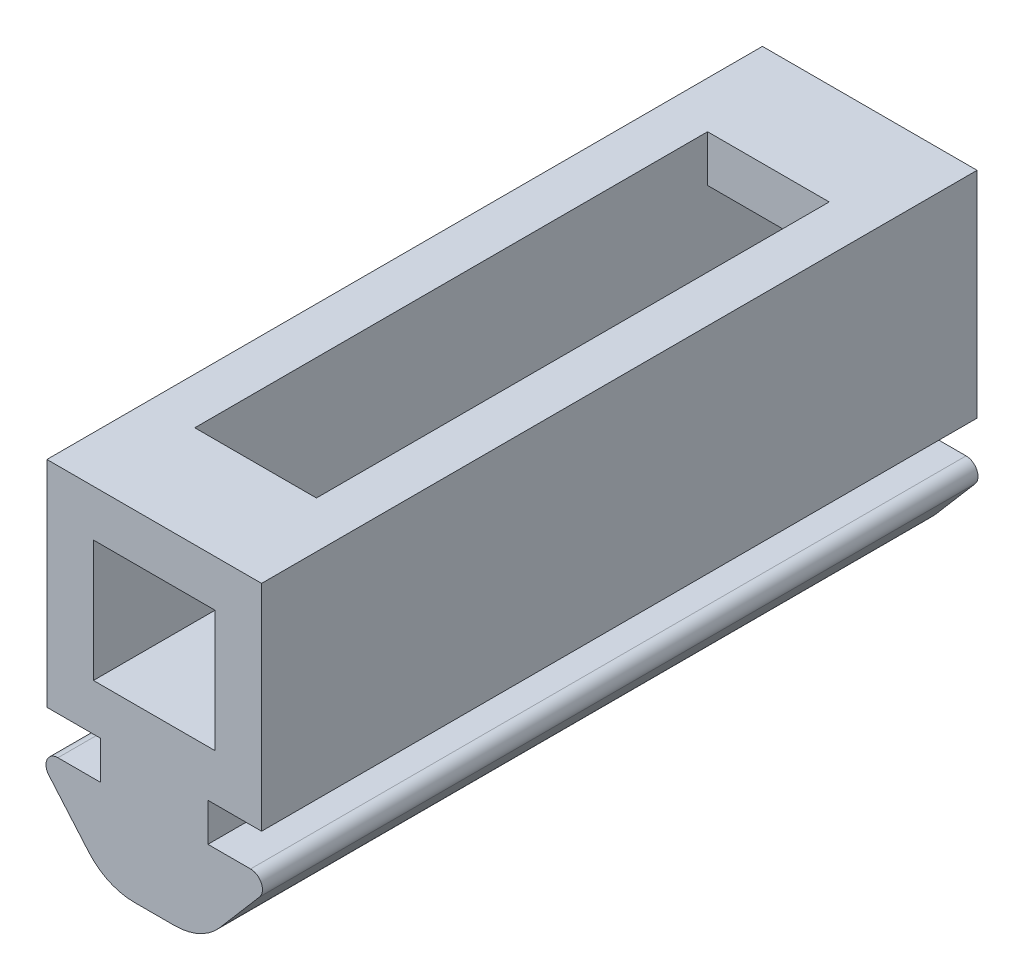
ISO-10303-21;
HEADER;
FILE_DESCRIPTION(('STEP AP214'),'2;1');
FILE_NAME('part.step','',(''),(''),'','','');
FILE_SCHEMA(('AUTOMOTIVE_DESIGN { 1 0 10303 214 1 1 1 1 }'));
ENDSEC;
DATA;
#1=APPLICATION_CONTEXT('core data for automotive mechanical design processes');
#2=APPLICATION_PROTOCOL_DEFINITION('international standard','automotive_design',2000,#1);
#3=PRODUCT_CONTEXT('',#1,'mechanical');
#4=PRODUCT('Part','Part','',(#3));
#5=PRODUCT_RELATED_PRODUCT_CATEGORY('part','',(#4));
#6=PRODUCT_DEFINITION_FORMATION('','',#4);
#7=PRODUCT_DEFINITION_CONTEXT('part definition',#1,'design');
#8=PRODUCT_DEFINITION('design','',#6,#7);
#9=PRODUCT_DEFINITION_SHAPE('','',#8);
#10=(LENGTH_UNIT() NAMED_UNIT(*) SI_UNIT(.MILLI.,.METRE.));
#11=(NAMED_UNIT(*) PLANE_ANGLE_UNIT() SI_UNIT($,.RADIAN.));
#12=(NAMED_UNIT(*) SI_UNIT($,.STERADIAN.) SOLID_ANGLE_UNIT());
#13=UNCERTAINTY_MEASURE_WITH_UNIT(LENGTH_MEASURE(1.E-05),#10,'distance_accuracy_value','');
#14=(GEOMETRIC_REPRESENTATION_CONTEXT(3) GLOBAL_UNCERTAINTY_ASSIGNED_CONTEXT((#13)) GLOBAL_UNIT_ASSIGNED_CONTEXT((#10,
#11,#12)) REPRESENTATION_CONTEXT('',''));
#15=CARTESIAN_POINT('',(0.,0.,0.));
#16=DIRECTION('',(0.,0.,1.));
#17=DIRECTION('',(1.,0.,0.));
#18=AXIS2_PLACEMENT_3D('',#15,#16,#17);
#19=CARTESIAN_POINT('',(0.,24.6,60.));
#20=DIRECTION('',(0.,1.,0.));
#21=DIRECTION('',(0.,0.,1.));
#22=AXIS2_PLACEMENT_3D('',#19,#20,#21);
#23=PLANE('',#22);
#24=DIRECTION('',(0.,0.,-1.));
#25=VECTOR('',#24,1.);
#26=CARTESIAN_POINT('',(-5.1,24.6,60.));
#27=LINE('',#26,#25);
#28=CARTESIAN_POINT('',(-5.1,24.6,60.));
#29=VERTEX_POINT('',#28);
#30=CARTESIAN_POINT('',(-5.1,24.6,51.5));
#31=VERTEX_POINT('',#30);
#32=EDGE_CURVE('E358',#29,#31,#27,.T.);
#33=ORIENTED_EDGE('',*,*,#32,.T.);
#34=DIRECTION('',(1.,0.,0.));
#35=VECTOR('',#34,1.);
#36=CARTESIAN_POINT('',(0.,24.6,51.5));
#37=LINE('',#36,#35);
#38=CARTESIAN_POINT('',(5.1,24.6,51.5));
#39=VERTEX_POINT('',#38);
#40=EDGE_CURVE('E244',#31,#39,#37,.T.);
#41=ORIENTED_EDGE('',*,*,#40,.T.);
#42=DIRECTION('',(0.,0.,-1.));
#43=VECTOR('',#42,1.);
#44=CARTESIAN_POINT('',(5.1,24.6,60.));
#45=LINE('',#44,#43);
#46=CARTESIAN_POINT('',(5.1,24.6,60.));
#47=VERTEX_POINT('',#46);
#48=EDGE_CURVE('E369',#47,#39,#45,.T.);
#49=ORIENTED_EDGE('',*,*,#48,.F.);
#50=DIRECTION('',(1.,0.,0.));
#51=VECTOR('',#50,1.);
#52=CARTESIAN_POINT('',(0.,24.6,60.));
#53=LINE('',#52,#51);
#54=EDGE_CURVE('E289',#29,#47,#53,.T.);
#55=ORIENTED_EDGE('',*,*,#54,.F.);
#56=EDGE_LOOP('',(#33,#41,#49,#55));
#57=FACE_BOUND('',#56,.T.);
#58=ADVANCED_FACE('F45',(#57),#23,.F.);
#59=CARTESIAN_POINT('',(5.1,24.6,8.5));
#60=VERTEX_POINT('',#59);
#61=CARTESIAN_POINT('',(5.1,24.6,0.));
#62=VERTEX_POINT('',#61);
#63=EDGE_CURVE('E368',#60,#62,#45,.T.);
#64=ORIENTED_EDGE('',*,*,#63,.F.);
#65=DIRECTION('',(-1.,0.,0.));
#66=VECTOR('',#65,1.);
#67=CARTESIAN_POINT('',(0.,24.6,8.50000000000001));
#68=LINE('',#67,#66);
#69=CARTESIAN_POINT('',(-5.1,24.6,8.50000000000001));
#70=VERTEX_POINT('',#69);
#71=EDGE_CURVE('E237',#60,#70,#68,.T.);
#72=ORIENTED_EDGE('',*,*,#71,.T.);
#73=CARTESIAN_POINT('',(-5.1,24.6,0.));
#74=VERTEX_POINT('',#73);
#75=EDGE_CURVE('E213',#70,#74,#27,.T.);
#76=ORIENTED_EDGE('',*,*,#75,.T.);
#77=DIRECTION('',(1.,0.,0.));
#78=VECTOR('',#77,1.);
#79=CARTESIAN_POINT('',(0.,24.6,0.));
#80=LINE('',#79,#78);
#81=EDGE_CURVE('E343',#74,#62,#80,.T.);
#82=ORIENTED_EDGE('',*,*,#81,.T.);
#83=EDGE_LOOP('',(#64,#72,#76,#82));
#84=FACE_BOUND('',#83,.T.);
#85=ADVANCED_FACE('F527',(#84),#23,.F.);
#86=CARTESIAN_POINT('',(5.1,0.,60.));
#87=DIRECTION('',(1.,0.,0.));
#88=DIRECTION('',(0.,0.,-1.));
#89=AXIS2_PLACEMENT_3D('',#86,#87,#88);
#90=PLANE('',#89);
#91=ORIENTED_EDGE('',*,*,#48,.T.);
#92=DIRECTION('',(0.,1.,0.));
#93=VECTOR('',#92,1.);
#94=CARTESIAN_POINT('',(5.1,18.5,51.5));
#95=LINE('',#94,#93);
#96=CARTESIAN_POINT('',(5.1,28.5,51.5));
#97=VERTEX_POINT('',#96);
#98=EDGE_CURVE('E234',#39,#97,#95,.T.);
#99=ORIENTED_EDGE('',*,*,#98,.T.);
#100=DIRECTION('',(0.,0.,-1.));
#101=VECTOR('',#100,1.);
#102=CARTESIAN_POINT('',(5.1,28.5,8.5));
#103=LINE('',#102,#101);
#104=CARTESIAN_POINT('',(5.1,28.5,8.50000000000001));
#105=VERTEX_POINT('',#104);
#106=EDGE_CURVE('E61',#97,#105,#103,.T.);
#107=ORIENTED_EDGE('',*,*,#106,.T.);
#108=DIRECTION('',(0.,1.,0.));
#109=VECTOR('',#108,1.);
#110=CARTESIAN_POINT('',(5.1,18.5,8.5));
#111=LINE('',#110,#109);
#112=EDGE_CURVE('E216',#60,#105,#111,.T.);
#113=ORIENTED_EDGE('',*,*,#112,.F.);
#114=ORIENTED_EDGE('',*,*,#63,.T.);
#115=DIRECTION('',(0.,-1.,0.));
#116=VECTOR('',#115,1.);
#117=CARTESIAN_POINT('',(5.1,0.,0.));
#118=LINE('',#117,#116);
#119=CARTESIAN_POINT('',(5.1,14.4,0.));
#120=VERTEX_POINT('',#119);
#121=EDGE_CURVE('E347',#62,#120,#118,.T.);
#122=ORIENTED_EDGE('',*,*,#121,.T.);
#123=DIRECTION('',(0.,0.,-1.));
#124=VECTOR('',#123,1.);
#125=CARTESIAN_POINT('',(5.1,14.4,60.));
#126=LINE('',#125,#124);
#127=CARTESIAN_POINT('',(5.1,14.4,60.));
#128=VERTEX_POINT('',#127);
#129=EDGE_CURVE('E365',#128,#120,#126,.T.);
#130=ORIENTED_EDGE('',*,*,#129,.F.);
#131=DIRECTION('',(0.,-1.,0.));
#132=VECTOR('',#131,1.);
#133=CARTESIAN_POINT('',(5.1,0.,60.));
#134=LINE('',#133,#132);
#135=EDGE_CURVE('E293',#47,#128,#134,.T.);
#136=ORIENTED_EDGE('',*,*,#135,.F.);
#137=EDGE_LOOP('',(#91,#99,#107,#113,#114,#122,#130,#136));
#138=FACE_BOUND('',#137,.T.);
#139=ADVANCED_FACE('F522',(#138),#90,.F.);
#140=CARTESIAN_POINT('',(0.,14.4,60.));
#141=DIRECTION('',(0.,1.,0.));
#142=DIRECTION('',(0.,0.,1.));
#143=AXIS2_PLACEMENT_3D('',#140,#141,#142);
#144=PLANE('',#143);
#145=DIRECTION('',(1.,0.,0.));
#146=VECTOR('',#145,1.);
#147=CARTESIAN_POINT('',(0.,14.4,0.));
#148=LINE('',#147,#146);
#149=CARTESIAN_POINT('',(-5.1,14.4,0.));
#150=VERTEX_POINT('',#149);
#151=EDGE_CURVE('E351',#150,#120,#148,.T.);
#152=ORIENTED_EDGE('',*,*,#151,.F.);
#153=DIRECTION('',(0.,0.,-1.));
#154=VECTOR('',#153,1.);
#155=CARTESIAN_POINT('',(-5.1,14.4,60.));
#156=LINE('',#155,#154);
#157=CARTESIAN_POINT('',(-5.1,14.4,60.));
#158=VERTEX_POINT('',#157);
#159=EDGE_CURVE('E362',#158,#150,#156,.T.);
#160=ORIENTED_EDGE('',*,*,#159,.F.);
#161=DIRECTION('',(1.,0.,0.));
#162=VECTOR('',#161,1.);
#163=CARTESIAN_POINT('',(0.,14.4,60.));
#164=LINE('',#163,#162);
#165=EDGE_CURVE('E296',#158,#128,#164,.T.);
#166=ORIENTED_EDGE('',*,*,#165,.T.);
#167=ORIENTED_EDGE('',*,*,#129,.T.);
#168=EDGE_LOOP('',(#152,#160,#166,#167));
#169=FACE_BOUND('',#168,.T.);
#170=ADVANCED_FACE('F534',(#169),#144,.T.);
#171=CARTESIAN_POINT('',(9.,0.,60.));
#172=DIRECTION('',(1.,0.,0.));
#173=DIRECTION('',(0.,1.,0.));
#174=AXIS2_PLACEMENT_3D('',#171,#172,#173);
#175=PLANE('',#174);
#176=DIRECTION('',(0.,-1.,0.));
#177=VECTOR('',#176,1.);
#178=CARTESIAN_POINT('',(9.,0.,0.));
#179=LINE('',#178,#177);
#180=CARTESIAN_POINT('',(8.99999999999999,28.5,0.));
#181=VERTEX_POINT('',#180);
#182=CARTESIAN_POINT('',(9.,10.5,0.));
#183=VERTEX_POINT('',#182);
#184=EDGE_CURVE('E248',#181,#183,#179,.T.);
#185=ORIENTED_EDGE('',*,*,#184,.F.);
#186=DIRECTION('',(0.,0.,-1.));
#187=VECTOR('',#186,1.);
#188=CARTESIAN_POINT('',(8.99999999999999,28.5,60.));
#189=LINE('',#188,#187);
#190=CARTESIAN_POINT('',(8.99999999999999,28.5,60.));
#191=VERTEX_POINT('',#190);
#192=EDGE_CURVE('E399',#191,#181,#189,.T.);
#193=ORIENTED_EDGE('',*,*,#192,.F.);
#194=DIRECTION('',(0.,-1.,0.));
#195=VECTOR('',#194,1.);
#196=CARTESIAN_POINT('',(9.,0.,60.));
#197=LINE('',#196,#195);
#198=CARTESIAN_POINT('',(9.,10.5,60.));
#199=VERTEX_POINT('',#198);
#200=EDGE_CURVE('E249',#191,#199,#197,.T.);
#201=ORIENTED_EDGE('',*,*,#200,.T.);
#202=DIRECTION('',(0.,0.,-1.));
#203=VECTOR('',#202,1.);
#204=CARTESIAN_POINT('',(9.,10.5,60.));
#205=LINE('',#204,#203);
#206=EDGE_CURVE('E304',#199,#183,#205,.T.);
#207=ORIENTED_EDGE('',*,*,#206,.T.);
#208=EDGE_LOOP('',(#185,#193,#201,#207));
#209=FACE_BOUND('',#208,.T.);
#210=ADVANCED_FACE('F509',(#209),#175,.T.);
#211=CARTESIAN_POINT('',(0.,28.5,60.));
#212=DIRECTION('',(0.,1.,0.));
#213=DIRECTION('',(0.,0.,1.));
#214=AXIS2_PLACEMENT_3D('',#211,#212,#213);
#215=PLANE('',#214);
#216=ORIENTED_EDGE('',*,*,#106,.F.);
#217=DIRECTION('',(1.,0.,0.));
#218=VECTOR('',#217,1.);
#219=CARTESIAN_POINT('',(-5.1,28.5,51.5));
#220=LINE('',#219,#218);
#221=CARTESIAN_POINT('',(-5.1,28.5,51.5));
#222=VERTEX_POINT('',#221);
#223=EDGE_CURVE('E227',#222,#97,#220,.T.);
#224=ORIENTED_EDGE('',*,*,#223,.F.);
#225=DIRECTION('',(0.,0.,1.));
#226=VECTOR('',#225,1.);
#227=CARTESIAN_POINT('',(-5.1,28.5,8.5));
#228=LINE('',#227,#226);
#229=CARTESIAN_POINT('',(-5.1,28.5,8.5));
#230=VERTEX_POINT('',#229);
#231=EDGE_CURVE('E210',#230,#222,#228,.T.);
#232=ORIENTED_EDGE('',*,*,#231,.F.);
#233=DIRECTION('',(-1.,0.,0.));
#234=VECTOR('',#233,1.);
#235=CARTESIAN_POINT('',(-5.1,28.5,8.5));
#236=LINE('',#235,#234);
#237=EDGE_CURVE('E219',#105,#230,#236,.T.);
#238=ORIENTED_EDGE('',*,*,#237,.F.);
#239=EDGE_LOOP('',(#216,#224,#232,#238));
#240=FACE_BOUND('',#239,.T.);
#241=DIRECTION('',(1.,0.,0.));
#242=VECTOR('',#241,1.);
#243=CARTESIAN_POINT('',(0.,28.5,0.));
#244=LINE('',#243,#242);
#245=CARTESIAN_POINT('',(-9.00000000000001,28.5,0.));
#246=VERTEX_POINT('',#245);
#247=EDGE_CURVE('E308',#246,#181,#244,.T.);
#248=ORIENTED_EDGE('',*,*,#247,.F.);
#249=DIRECTION('',(0.,0.,-1.));
#250=VECTOR('',#249,1.);
#251=CARTESIAN_POINT('',(-9.00000000000001,28.5,60.));
#252=LINE('',#251,#250);
#253=CARTESIAN_POINT('',(-9.00000000000001,28.5,60.));
#254=VERTEX_POINT('',#253);
#255=EDGE_CURVE('E396',#254,#246,#252,.T.);
#256=ORIENTED_EDGE('',*,*,#255,.F.);
#257=DIRECTION('',(1.,0.,0.));
#258=VECTOR('',#257,1.);
#259=CARTESIAN_POINT('',(0.,28.5,60.));
#260=LINE('',#259,#258);
#261=EDGE_CURVE('E253',#254,#191,#260,.T.);
#262=ORIENTED_EDGE('',*,*,#261,.T.);
#263=ORIENTED_EDGE('',*,*,#192,.T.);
#264=EDGE_LOOP('',(#248,#256,#262,#263));
#265=FACE_BOUND('',#264,.T.);
#266=ADVANCED_FACE('F224',(#240,#265),#215,.T.);
#267=CARTESIAN_POINT('',(-9.00000000000001,0.,60.));
#268=DIRECTION('',(1.,0.,0.));
#269=DIRECTION('',(0.,0.,-1.));
#270=AXIS2_PLACEMENT_3D('',#267,#268,#269);
#271=PLANE('',#270);
#272=DIRECTION('',(0.,-1.,0.));
#273=VECTOR('',#272,1.);
#274=CARTESIAN_POINT('',(-9.00000000000001,0.,0.));
#275=LINE('',#274,#273);
#276=CARTESIAN_POINT('',(-9.00000000000001,10.5,0.));
#277=VERTEX_POINT('',#276);
#278=EDGE_CURVE('E312',#246,#277,#275,.T.);
#279=ORIENTED_EDGE('',*,*,#278,.T.);
#280=DIRECTION('',(0.,0.,-1.));
#281=VECTOR('',#280,1.);
#282=CARTESIAN_POINT('',(-9.00000000000001,10.5,60.));
#283=LINE('',#282,#281);
#284=CARTESIAN_POINT('',(-9.00000000000001,10.5,60.));
#285=VERTEX_POINT('',#284);
#286=EDGE_CURVE('E392',#285,#277,#283,.T.);
#287=ORIENTED_EDGE('',*,*,#286,.F.);
#288=DIRECTION('',(0.,-1.,0.));
#289=VECTOR('',#288,1.);
#290=CARTESIAN_POINT('',(-9.00000000000001,0.,60.));
#291=LINE('',#290,#289);
#292=EDGE_CURVE('E258',#254,#285,#291,.T.);
#293=ORIENTED_EDGE('',*,*,#292,.F.);
#294=ORIENTED_EDGE('',*,*,#255,.T.);
#295=EDGE_LOOP('',(#279,#287,#293,#294));
#296=FACE_BOUND('',#295,.T.);
#297=ADVANCED_FACE('F502',(#296),#271,.F.);
#298=CARTESIAN_POINT('',(0.,10.5,60.));
#299=DIRECTION('',(0.,1.,0.));
#300=DIRECTION('',(0.,0.,1.));
#301=AXIS2_PLACEMENT_3D('',#298,#299,#300);
#302=PLANE('',#301);
#303=DIRECTION('',(1.,0.,0.));
#304=VECTOR('',#303,1.);
#305=CARTESIAN_POINT('',(0.,10.5,0.));
#306=LINE('',#305,#304);
#307=CARTESIAN_POINT('',(-4.5,10.5,0.));
#308=VERTEX_POINT('',#307);
#309=EDGE_CURVE('E315',#277,#308,#306,.T.);
#310=ORIENTED_EDGE('',*,*,#309,.T.);
#311=DIRECTION('',(0.,0.,-1.));
#312=VECTOR('',#311,1.);
#313=CARTESIAN_POINT('',(-4.5,10.5,60.));
#314=LINE('',#313,#312);
#315=CARTESIAN_POINT('',(-4.5,10.5,60.));
#316=VERTEX_POINT('',#315);
#317=EDGE_CURVE('E388',#316,#308,#314,.T.);
#318=ORIENTED_EDGE('',*,*,#317,.F.);
#319=DIRECTION('',(1.,0.,0.));
#320=VECTOR('',#319,1.);
#321=CARTESIAN_POINT('',(0.,10.5,60.));
#322=LINE('',#321,#320);
#323=EDGE_CURVE('E261',#285,#316,#322,.T.);
#324=ORIENTED_EDGE('',*,*,#323,.F.);
#325=ORIENTED_EDGE('',*,*,#286,.T.);
#326=EDGE_LOOP('',(#310,#318,#324,#325));
#327=FACE_BOUND('',#326,.T.);
#328=ADVANCED_FACE('F497',(#327),#302,.F.);
#329=CARTESIAN_POINT('',(-4.5,0.,60.));
#330=DIRECTION('',(1.,0.,0.));
#331=DIRECTION('',(0.,1.,0.));
#332=AXIS2_PLACEMENT_3D('',#329,#330,#331);
#333=PLANE('',#332);
#334=DIRECTION('',(0.,-1.,0.));
#335=VECTOR('',#334,1.);
#336=CARTESIAN_POINT('',(-4.5,0.,0.));
#337=LINE('',#336,#335);
#338=CARTESIAN_POINT('',(-4.5,7.3,0.));
#339=VERTEX_POINT('',#338);
#340=EDGE_CURVE('E318',#308,#339,#337,.T.);
#341=ORIENTED_EDGE('',*,*,#340,.T.);
#342=DIRECTION('',(0.,0.,-1.));
#343=VECTOR('',#342,1.);
#344=CARTESIAN_POINT('',(-4.5,7.3,60.));
#345=LINE('',#344,#343);
#346=CARTESIAN_POINT('',(-4.5,7.3,60.));
#347=VERTEX_POINT('',#346);
#348=EDGE_CURVE('E384',#347,#339,#345,.T.);
#349=ORIENTED_EDGE('',*,*,#348,.F.);
#350=DIRECTION('',(0.,-1.,0.));
#351=VECTOR('',#350,1.);
#352=CARTESIAN_POINT('',(-4.5,0.,60.));
#353=LINE('',#352,#351);
#354=EDGE_CURVE('E264',#316,#347,#353,.T.);
#355=ORIENTED_EDGE('',*,*,#354,.F.);
#356=ORIENTED_EDGE('',*,*,#317,.T.);
#357=EDGE_LOOP('',(#341,#349,#355,#356));
#358=FACE_BOUND('',#357,.T.);
#359=ADVANCED_FACE('F491',(#358),#333,.F.);
#360=CARTESIAN_POINT('',(0.,7.3,60.));
#361=DIRECTION('',(0.,-1.,0.));
#362=DIRECTION('',(1.,0.,0.));
#363=AXIS2_PLACEMENT_3D('',#360,#361,#362);
#364=PLANE('',#363);
#365=DIRECTION('',(-1.,0.,0.));
#366=VECTOR('',#365,1.);
#367=CARTESIAN_POINT('',(0.,7.3,0.));
#368=LINE('',#367,#366);
#369=CARTESIAN_POINT('',(-8.07739440936548,7.3,0.));
#370=VERTEX_POINT('',#369);
#371=EDGE_CURVE('E322',#339,#370,#368,.T.);
#372=ORIENTED_EDGE('',*,*,#371,.T.);
#373=DIRECTION('',(0.,0.,-1.));
#374=VECTOR('',#373,1.);
#375=CARTESIAN_POINT('',(-8.07739440936548,7.3,60.));
#376=LINE('',#375,#374);
#377=CARTESIAN_POINT('',(-8.07739440936548,7.3,60.));
#378=VERTEX_POINT('',#377);
#379=EDGE_CURVE('E426',#370,#378,#376,.F.);
#380=ORIENTED_EDGE('',*,*,#379,.T.);
#381=DIRECTION('',(-1.,0.,0.));
#382=VECTOR('',#381,1.);
#383=CARTESIAN_POINT('',(0.,7.3,60.));
#384=LINE('',#383,#382);
#385=EDGE_CURVE('E268',#347,#378,#384,.T.);
#386=ORIENTED_EDGE('',*,*,#385,.F.);
#387=ORIENTED_EDGE('',*,*,#348,.T.);
#388=EDGE_LOOP('',(#372,#380,#386,#387));
#389=FACE_BOUND('',#388,.T.);
#390=ADVANCED_FACE('F486',(#389),#364,.F.);
#391=CARTESIAN_POINT('',(-2.30811293684524,-1.97612408976476,60.));
#392=DIRECTION('',(0.759623745160267,0.650362795513927,0.));
#393=DIRECTION('',(-0.650362795513927,0.759623745160267,0.));
#394=AXIS2_PLACEMENT_3D('',#391,#392,#393);
#395=PLANE('',#394);
#396=DIRECTION('',(0.650362795513927,-0.759623745160267,0.));
#397=VECTOR('',#396,1.);
#398=CARTESIAN_POINT('',(-2.30811293684524,-1.97612408976476,0.));
#399=LINE('',#398,#397);
#400=CARTESIAN_POINT('',(-8.83701815452575,5.64963720448607,0.));
#401=VERTEX_POINT('',#400);
#402=CARTESIAN_POINT('',(-5.49673460824518,1.74818602243036,0.));
#403=VERTEX_POINT('',#402);
#404=EDGE_CURVE('E326',#401,#403,#399,.T.);
#405=ORIENTED_EDGE('',*,*,#404,.T.);
#406=DIRECTION('',(0.,0.,-1.));
#407=VECTOR('',#406,1.);
#408=CARTESIAN_POINT('',(-5.49673460824518,1.74818602243036,60.));
#409=LINE('',#408,#407);
#410=CARTESIAN_POINT('',(-5.49673460824518,1.74818602243036,60.));
#411=VERTEX_POINT('',#410);
#412=EDGE_CURVE('E11',#403,#411,#409,.F.);
#413=ORIENTED_EDGE('',*,*,#412,.T.);
#414=DIRECTION('',(0.650362795513927,-0.759623745160267,0.));
#415=VECTOR('',#414,1.);
#416=CARTESIAN_POINT('',(-2.30811293684524,-1.97612408976476,60.));
#417=LINE('',#416,#415);
#418=CARTESIAN_POINT('',(-8.83701815452575,5.64963720448607,60.));
#419=VERTEX_POINT('',#418);
#420=EDGE_CURVE('E272',#419,#411,#417,.T.);
#421=ORIENTED_EDGE('',*,*,#420,.F.);
#422=DIRECTION('',(0.,0.,-1.));
#423=VECTOR('',#422,1.);
#424=CARTESIAN_POINT('',(-8.83701815452575,5.64963720448607,60.));
#425=LINE('',#424,#423);
#426=EDGE_CURVE('E422',#419,#401,#425,.T.);
#427=ORIENTED_EDGE('',*,*,#426,.T.);
#428=EDGE_LOOP('',(#405,#413,#421,#427));
#429=FACE_BOUND('',#428,.T.);
#430=ADVANCED_FACE('F476',(#429),#395,.F.);
#431=CARTESIAN_POINT('',(0.,0.,60.));
#432=DIRECTION('',(0.,1.,0.));
#433=DIRECTION('',(0.,0.,1.));
#434=AXIS2_PLACEMENT_3D('',#431,#432,#433);
#435=PLANE('',#434);
#436=DIRECTION('',(1.,0.,0.));
#437=VECTOR('',#436,1.);
#438=CARTESIAN_POINT('',(0.,0.,0.));
#439=LINE('',#438,#437);
#440=CARTESIAN_POINT('',(-1.69861588244384,0.,0.));
#441=VERTEX_POINT('',#440);
#442=CARTESIAN_POINT('',(1.69861588244384,0.,0.));
#443=VERTEX_POINT('',#442);
#444=EDGE_CURVE('E330',#441,#443,#439,.T.);
#445=ORIENTED_EDGE('',*,*,#444,.T.);
#446=DIRECTION('',(0.,0.,-1.));
#447=VECTOR('',#446,1.);
#448=CARTESIAN_POINT('',(1.69861588244384,0.,60.));
#449=LINE('',#448,#447);
#450=CARTESIAN_POINT('',(1.69861588244384,0.,60.));
#451=VERTEX_POINT('',#450);
#452=EDGE_CURVE('E443',#443,#451,#449,.F.);
#453=ORIENTED_EDGE('',*,*,#452,.T.);
#454=DIRECTION('',(1.,0.,0.));
#455=VECTOR('',#454,1.);
#456=CARTESIAN_POINT('',(0.,0.,60.));
#457=LINE('',#456,#455);
#458=CARTESIAN_POINT('',(-1.69861588244384,0.,60.));
#459=VERTEX_POINT('',#458);
#460=EDGE_CURVE('E276',#459,#451,#457,.T.);
#461=ORIENTED_EDGE('',*,*,#460,.F.);
#462=DIRECTION('',(0.,0.,-1.));
#463=VECTOR('',#462,1.);
#464=CARTESIAN_POINT('',(-1.69861588244384,0.,60.));
#465=LINE('',#464,#463);
#466=EDGE_CURVE('E439',#459,#441,#465,.T.);
#467=ORIENTED_EDGE('',*,*,#466,.T.);
#468=EDGE_LOOP('',(#445,#453,#461,#467));
#469=FACE_BOUND('',#468,.T.);
#470=ADVANCED_FACE('F469',(#469),#435,.F.);
#471=CARTESIAN_POINT('',(2.30811293684524,-1.97612408976476,60.));
#472=DIRECTION('',(-0.759623745160267,0.650362795513927,0.));
#473=DIRECTION('',(-0.650362795513927,-0.759623745160267,0.));
#474=AXIS2_PLACEMENT_3D('',#471,#472,#473);
#475=PLANE('',#474);
#476=DIRECTION('',(0.650362795513927,0.759623745160267,0.));
#477=VECTOR('',#476,1.);
#478=CARTESIAN_POINT('',(2.30811293684524,-1.97612408976476,60.));
#479=LINE('',#478,#477);
#480=CARTESIAN_POINT('',(5.49673460824518,1.74818602243037,60.));
#481=VERTEX_POINT('',#480);
#482=CARTESIAN_POINT('',(8.83701815452575,5.64963720448607,60.));
#483=VERTEX_POINT('',#482);
#484=EDGE_CURVE('E280',#481,#483,#479,.T.);
#485=ORIENTED_EDGE('',*,*,#484,.F.);
#486=DIRECTION('',(0.,0.,-1.));
#487=VECTOR('',#486,1.);
#488=CARTESIAN_POINT('',(5.49673460824518,1.74818602243036,60.));
#489=LINE('',#488,#487);
#490=CARTESIAN_POINT('',(5.49673460824518,1.74818602243037,0.));
#491=VERTEX_POINT('',#490);
#492=EDGE_CURVE('E429',#481,#491,#489,.T.);
#493=ORIENTED_EDGE('',*,*,#492,.T.);
#494=DIRECTION('',(0.650362795513927,0.759623745160267,0.));
#495=VECTOR('',#494,1.);
#496=CARTESIAN_POINT('',(2.30811293684524,-1.97612408976476,0.));
#497=LINE('',#496,#495);
#498=CARTESIAN_POINT('',(8.83701815452575,5.64963720448607,0.));
#499=VERTEX_POINT('',#498);
#500=EDGE_CURVE('E334',#491,#499,#497,.T.);
#501=ORIENTED_EDGE('',*,*,#500,.T.);
#502=DIRECTION('',(0.,0.,-1.));
#503=VECTOR('',#502,1.);
#504=CARTESIAN_POINT('',(8.83701815452575,5.64963720448607,60.));
#505=LINE('',#504,#503);
#506=EDGE_CURVE('E412',#499,#483,#505,.F.);
#507=ORIENTED_EDGE('',*,*,#506,.T.);
#508=EDGE_LOOP('',(#485,#493,#501,#507));
#509=FACE_BOUND('',#508,.T.);
#510=ADVANCED_FACE('F459',(#509),#475,.F.);
#511=CARTESIAN_POINT('',(0.,7.3,60.));
#512=DIRECTION('',(0.,-1.,0.));
#513=DIRECTION('',(1.,0.,0.));
#514=AXIS2_PLACEMENT_3D('',#511,#512,#513);
#515=PLANE('',#514);
#516=DIRECTION('',(-1.,0.,0.));
#517=VECTOR('',#516,1.);
#518=CARTESIAN_POINT('',(0.,7.3,60.));
#519=LINE('',#518,#517);
#520=CARTESIAN_POINT('',(8.07739440936548,7.3,60.));
#521=VERTEX_POINT('',#520);
#522=CARTESIAN_POINT('',(4.5,7.3,60.));
#523=VERTEX_POINT('',#522);
#524=EDGE_CURVE('E283',#521,#523,#519,.T.);
#525=ORIENTED_EDGE('',*,*,#524,.F.);
#526=DIRECTION('',(0.,0.,-1.));
#527=VECTOR('',#526,1.);
#528=CARTESIAN_POINT('',(8.07739440936548,7.3,60.));
#529=LINE('',#528,#527);
#530=CARTESIAN_POINT('',(8.07739440936548,7.3,0.));
#531=VERTEX_POINT('',#530);
#532=EDGE_CURVE('E373',#521,#531,#529,.T.);
#533=ORIENTED_EDGE('',*,*,#532,.T.);
#534=DIRECTION('',(-1.,0.,0.));
#535=VECTOR('',#534,1.);
#536=CARTESIAN_POINT('',(0.,7.3,0.));
#537=LINE('',#536,#535);
#538=CARTESIAN_POINT('',(4.5,7.3,0.));
#539=VERTEX_POINT('',#538);
#540=EDGE_CURVE('E337',#531,#539,#537,.T.);
#541=ORIENTED_EDGE('',*,*,#540,.T.);
#542=DIRECTION('',(0.,0.,-1.));
#543=VECTOR('',#542,1.);
#544=CARTESIAN_POINT('',(4.5,7.3,60.));
#545=LINE('',#544,#543);
#546=EDGE_CURVE('E380',#523,#539,#545,.T.);
#547=ORIENTED_EDGE('',*,*,#546,.F.);
#548=EDGE_LOOP('',(#525,#533,#541,#547));
#549=FACE_BOUND('',#548,.T.);
#550=ADVANCED_FACE('F544',(#549),#515,.F.);
#551=CARTESIAN_POINT('',(4.5,0.,60.));
#552=DIRECTION('',(-1.,0.,0.));
#553=DIRECTION('',(0.,-1.,0.));
#554=AXIS2_PLACEMENT_3D('',#551,#552,#553);
#555=PLANE('',#554);
#556=DIRECTION('',(0.,1.,0.));
#557=VECTOR('',#556,1.);
#558=CARTESIAN_POINT('',(4.5,0.,0.));
#559=LINE('',#558,#557);
#560=CARTESIAN_POINT('',(4.5,10.5,0.));
#561=VERTEX_POINT('',#560);
#562=EDGE_CURVE('E340',#539,#561,#559,.T.);
#563=ORIENTED_EDGE('',*,*,#562,.T.);
#564=DIRECTION('',(0.,0.,-1.));
#565=VECTOR('',#564,1.);
#566=CARTESIAN_POINT('',(4.5,10.5,60.));
#567=LINE('',#566,#565);
#568=CARTESIAN_POINT('',(4.5,10.5,60.));
#569=VERTEX_POINT('',#568);
#570=EDGE_CURVE('E376',#569,#561,#567,.T.);
#571=ORIENTED_EDGE('',*,*,#570,.F.);
#572=DIRECTION('',(0.,1.,0.));
#573=VECTOR('',#572,1.);
#574=CARTESIAN_POINT('',(4.5,0.,60.));
#575=LINE('',#574,#573);
#576=EDGE_CURVE('E286',#523,#569,#575,.T.);
#577=ORIENTED_EDGE('',*,*,#576,.F.);
#578=ORIENTED_EDGE('',*,*,#546,.T.);
#579=EDGE_LOOP('',(#563,#571,#577,#578));
#580=FACE_BOUND('',#579,.T.);
#581=ADVANCED_FACE('F541',(#580),#555,.F.);
#582=EDGE_CURVE('E319',#561,#183,#306,.T.);
#583=ORIENTED_EDGE('',*,*,#582,.T.);
#584=ORIENTED_EDGE('',*,*,#206,.F.);
#585=EDGE_CURVE('E265',#569,#199,#322,.T.);
#586=ORIENTED_EDGE('',*,*,#585,.F.);
#587=ORIENTED_EDGE('',*,*,#570,.T.);
#588=EDGE_LOOP('',(#583,#584,#586,#587));
#589=FACE_BOUND('',#588,.T.);
#590=ADVANCED_FACE('F514',(#589),#302,.F.);
#591=CARTESIAN_POINT('',(-5.1,0.,60.));
#592=DIRECTION('',(1.,0.,0.));
#593=DIRECTION('',(0.,0.,-1.));
#594=AXIS2_PLACEMENT_3D('',#591,#592,#593);
#595=PLANE('',#594);
#596=ORIENTED_EDGE('',*,*,#75,.F.);
#597=DIRECTION('',(0.,1.,0.));
#598=VECTOR('',#597,1.);
#599=CARTESIAN_POINT('',(-5.1,18.5,8.5));
#600=LINE('',#599,#598);
#601=EDGE_CURVE('E69',#70,#230,#600,.T.);
#602=ORIENTED_EDGE('',*,*,#601,.T.);
#603=ORIENTED_EDGE('',*,*,#231,.T.);
#604=DIRECTION('',(0.,1.,0.));
#605=VECTOR('',#604,1.);
#606=CARTESIAN_POINT('',(-5.1,18.5,51.5));
#607=LINE('',#606,#605);
#608=EDGE_CURVE('E215',#31,#222,#607,.T.);
#609=ORIENTED_EDGE('',*,*,#608,.F.);
#610=ORIENTED_EDGE('',*,*,#32,.F.);
#611=DIRECTION('',(0.,-1.,0.));
#612=VECTOR('',#611,1.);
#613=CARTESIAN_POINT('',(-5.1,0.,60.));
#614=LINE('',#613,#612);
#615=EDGE_CURVE('E300',#29,#158,#614,.T.);
#616=ORIENTED_EDGE('',*,*,#615,.T.);
#617=ORIENTED_EDGE('',*,*,#159,.T.);
#618=DIRECTION('',(0.,-1.,0.));
#619=VECTOR('',#618,1.);
#620=CARTESIAN_POINT('',(-5.1,0.,0.));
#621=LINE('',#620,#619);
#622=EDGE_CURVE('E254',#74,#150,#621,.T.);
#623=ORIENTED_EDGE('',*,*,#622,.F.);
#624=EDGE_LOOP('',(#596,#602,#603,#609,#610,#616,#617,#623));
#625=FACE_BOUND('',#624,.T.);
#626=ADVANCED_FACE('F207',(#625),#595,.T.);
#627=CARTESIAN_POINT('',(0.,0.,60.));
#628=DIRECTION('',(0.,0.,1.));
#629=DIRECTION('',(1.,0.,0.));
#630=AXIS2_PLACEMENT_3D('',#627,#628,#629);
#631=PLANE('',#630);
#632=ORIENTED_EDGE('',*,*,#460,.T.);
#633=CARTESIAN_POINT('',(1.69861588244384,5.,60.));
#634=DIRECTION('',(0.,0.,1.));
#635=DIRECTION('',(1.,0.,0.));
#636=AXIS2_PLACEMENT_3D('',#633,#634,#635);
#637=CIRCLE('',#636,5.);
#638=EDGE_CURVE('E54',#451,#481,#637,.T.);
#639=ORIENTED_EDGE('',*,*,#638,.T.);
#640=ORIENTED_EDGE('',*,*,#484,.T.);
#641=CARTESIAN_POINT('',(8.07739440936548,6.3,60.));
#642=DIRECTION('',(0.,0.,1.));
#643=DIRECTION('',(1.,0.,0.));
#644=AXIS2_PLACEMENT_3D('',#641,#642,#643);
#645=CIRCLE('',#644,1.);
#646=EDGE_CURVE('E419',#483,#521,#645,.T.);
#647=ORIENTED_EDGE('',*,*,#646,.T.);
#648=ORIENTED_EDGE('',*,*,#524,.T.);
#649=ORIENTED_EDGE('',*,*,#576,.T.);
#650=ORIENTED_EDGE('',*,*,#585,.T.);
#651=ORIENTED_EDGE('',*,*,#200,.F.);
#652=ORIENTED_EDGE('',*,*,#261,.F.);
#653=ORIENTED_EDGE('',*,*,#292,.T.);
#654=ORIENTED_EDGE('',*,*,#323,.T.);
#655=ORIENTED_EDGE('',*,*,#354,.T.);
#656=ORIENTED_EDGE('',*,*,#385,.T.);
#657=CARTESIAN_POINT('',(-8.07739440936548,6.3,60.));
#658=DIRECTION('',(0.,0.,1.));
#659=DIRECTION('',(1.,0.,0.));
#660=AXIS2_PLACEMENT_3D('',#657,#658,#659);
#661=CIRCLE('',#660,1.);
#662=EDGE_CURVE('E416',#378,#419,#661,.T.);
#663=ORIENTED_EDGE('',*,*,#662,.T.);
#664=ORIENTED_EDGE('',*,*,#420,.T.);
#665=CARTESIAN_POINT('',(-1.69861588244384,5.,60.));
#666=DIRECTION('',(0.,0.,1.));
#667=DIRECTION('',(1.,0.,0.));
#668=AXIS2_PLACEMENT_3D('',#665,#666,#667);
#669=CIRCLE('',#668,5.);
#670=EDGE_CURVE('E446',#411,#459,#669,.T.);
#671=ORIENTED_EDGE('',*,*,#670,.T.);
#672=EDGE_LOOP('',(#632,#639,#640,#647,#648,#649,#650,#651,#652,#653,#654,#655,#656,#663,#664,#671));
#673=FACE_BOUND('',#672,.T.);
#674=ORIENTED_EDGE('',*,*,#54,.T.);
#675=ORIENTED_EDGE('',*,*,#135,.T.);
#676=ORIENTED_EDGE('',*,*,#165,.F.);
#677=ORIENTED_EDGE('',*,*,#615,.F.);
#678=EDGE_LOOP('',(#674,#675,#676,#677));
#679=FACE_BOUND('',#678,.T.);
#680=ADVANCED_FACE('F452',(#673,#679),#631,.T.);
#681=CARTESIAN_POINT('',(0.,0.,0.));
#682=DIRECTION('',(0.,0.,1.));
#683=DIRECTION('',(1.,0.,0.));
#684=AXIS2_PLACEMENT_3D('',#681,#682,#683);
#685=PLANE('',#684);
#686=ORIENTED_EDGE('',*,*,#500,.F.);
#687=CARTESIAN_POINT('',(1.69861588244384,5.,0.));
#688=DIRECTION('',(0.,0.,1.));
#689=DIRECTION('',(1.,0.,0.));
#690=AXIS2_PLACEMENT_3D('',#687,#688,#689);
#691=CIRCLE('',#690,5.);
#692=EDGE_CURVE('E436',#491,#443,#691,.F.);
#693=ORIENTED_EDGE('',*,*,#692,.T.);
#694=ORIENTED_EDGE('',*,*,#444,.F.);
#695=CARTESIAN_POINT('',(-1.69861588244384,5.,0.));
#696=DIRECTION('',(0.,0.,1.));
#697=DIRECTION('',(1.,0.,0.));
#698=AXIS2_PLACEMENT_3D('',#695,#696,#697);
#699=CIRCLE('',#698,5.);
#700=EDGE_CURVE('E433',#441,#403,#699,.F.);
#701=ORIENTED_EDGE('',*,*,#700,.T.);
#702=ORIENTED_EDGE('',*,*,#404,.F.);
#703=CARTESIAN_POINT('',(-8.07739440936548,6.3,0.));
#704=DIRECTION('',(0.,0.,1.));
#705=DIRECTION('',(1.,0.,0.));
#706=AXIS2_PLACEMENT_3D('',#703,#704,#705);
#707=CIRCLE('',#706,1.);
#708=EDGE_CURVE('E405',#401,#370,#707,.F.);
#709=ORIENTED_EDGE('',*,*,#708,.T.);
#710=ORIENTED_EDGE('',*,*,#371,.F.);
#711=ORIENTED_EDGE('',*,*,#340,.F.);
#712=ORIENTED_EDGE('',*,*,#309,.F.);
#713=ORIENTED_EDGE('',*,*,#278,.F.);
#714=ORIENTED_EDGE('',*,*,#247,.T.);
#715=ORIENTED_EDGE('',*,*,#184,.T.);
#716=ORIENTED_EDGE('',*,*,#582,.F.);
#717=ORIENTED_EDGE('',*,*,#562,.F.);
#718=ORIENTED_EDGE('',*,*,#540,.F.);
#719=CARTESIAN_POINT('',(8.07739440936548,6.3,0.));
#720=DIRECTION('',(0.,0.,1.));
#721=DIRECTION('',(1.,0.,0.));
#722=AXIS2_PLACEMENT_3D('',#719,#720,#721);
#723=CIRCLE('',#722,1.);
#724=EDGE_CURVE('E408',#531,#499,#723,.F.);
#725=ORIENTED_EDGE('',*,*,#724,.T.);
#726=EDGE_LOOP('',(#686,#693,#694,#701,#702,#709,#710,#711,#712,#713,#714,#715,#716,#717,#718,#725));
#727=FACE_BOUND('',#726,.T.);
#728=ORIENTED_EDGE('',*,*,#81,.F.);
#729=ORIENTED_EDGE('',*,*,#622,.T.);
#730=ORIENTED_EDGE('',*,*,#151,.T.);
#731=ORIENTED_EDGE('',*,*,#121,.F.);
#732=EDGE_LOOP('',(#728,#729,#730,#731));
#733=FACE_BOUND('',#732,.T.);
#734=ADVANCED_FACE('F466',(#727,#733),#685,.F.);
#735=CARTESIAN_POINT('',(8.07739440936548,6.3,60.));
#736=DIRECTION('',(0.,0.,-1.));
#737=DIRECTION('',(-1.,0.,0.));
#738=AXIS2_PLACEMENT_3D('',#735,#736,#737);
#739=CYLINDRICAL_SURFACE('',#738,1.);
#740=ORIENTED_EDGE('',*,*,#646,.F.);
#741=ORIENTED_EDGE('',*,*,#506,.F.);
#742=ORIENTED_EDGE('',*,*,#724,.F.);
#743=ORIENTED_EDGE('',*,*,#532,.F.);
#744=EDGE_LOOP('',(#740,#741,#742,#743));
#745=FACE_BOUND('',#744,.T.);
#746=ADVANCED_FACE('F565',(#745),#739,.T.);
#747=CARTESIAN_POINT('',(-8.07739440936548,6.3,60.));
#748=DIRECTION('',(0.,0.,-1.));
#749=DIRECTION('',(-1.,0.,0.));
#750=AXIS2_PLACEMENT_3D('',#747,#748,#749);
#751=CYLINDRICAL_SURFACE('',#750,1.);
#752=ORIENTED_EDGE('',*,*,#662,.F.);
#753=ORIENTED_EDGE('',*,*,#379,.F.);
#754=ORIENTED_EDGE('',*,*,#708,.F.);
#755=ORIENTED_EDGE('',*,*,#426,.F.);
#756=EDGE_LOOP('',(#752,#753,#754,#755));
#757=FACE_BOUND('',#756,.T.);
#758=ADVANCED_FACE('F481',(#757),#751,.T.);
#759=CARTESIAN_POINT('',(1.69861588244384,5.,60.));
#760=DIRECTION('',(0.,0.,-1.));
#761=DIRECTION('',(-1.,0.,0.));
#762=AXIS2_PLACEMENT_3D('',#759,#760,#761);
#763=CYLINDRICAL_SURFACE('',#762,5.);
#764=ORIENTED_EDGE('',*,*,#638,.F.);
#765=ORIENTED_EDGE('',*,*,#452,.F.);
#766=ORIENTED_EDGE('',*,*,#692,.F.);
#767=ORIENTED_EDGE('',*,*,#492,.F.);
#768=EDGE_LOOP('',(#764,#765,#766,#767));
#769=FACE_BOUND('',#768,.T.);
#770=ADVANCED_FACE('F463',(#769),#763,.T.);
#771=CARTESIAN_POINT('',(-1.69861588244384,5.,60.));
#772=DIRECTION('',(0.,0.,-1.));
#773=DIRECTION('',(-1.,0.,0.));
#774=AXIS2_PLACEMENT_3D('',#771,#772,#773);
#775=CYLINDRICAL_SURFACE('',#774,5.);
#776=ORIENTED_EDGE('',*,*,#670,.F.);
#777=ORIENTED_EDGE('',*,*,#412,.F.);
#778=ORIENTED_EDGE('',*,*,#700,.F.);
#779=ORIENTED_EDGE('',*,*,#466,.F.);
#780=EDGE_LOOP('',(#776,#777,#778,#779));
#781=FACE_BOUND('',#780,.T.);
#782=ADVANCED_FACE('F47',(#781),#775,.T.);
#783=CARTESIAN_POINT('',(-5.1,18.5,51.5));
#784=DIRECTION('',(0.,0.,1.));
#785=DIRECTION('',(1.,0.,0.));
#786=AXIS2_PLACEMENT_3D('',#783,#784,#785);
#787=PLANE('',#786);
#788=ORIENTED_EDGE('',*,*,#608,.T.);
#789=ORIENTED_EDGE('',*,*,#223,.T.);
#790=ORIENTED_EDGE('',*,*,#98,.F.);
#791=ORIENTED_EDGE('',*,*,#40,.F.);
#792=EDGE_LOOP('',(#788,#789,#790,#791));
#793=FACE_BOUND('',#792,.T.);
#794=ADVANCED_FACE('F574',(#793),#787,.F.);
#795=CARTESIAN_POINT('',(-5.1,18.5,8.5));
#796=DIRECTION('',(0.,0.,-1.));
#797=DIRECTION('',(-1.,0.,0.));
#798=AXIS2_PLACEMENT_3D('',#795,#796,#797);
#799=PLANE('',#798);
#800=ORIENTED_EDGE('',*,*,#112,.T.);
#801=ORIENTED_EDGE('',*,*,#237,.T.);
#802=ORIENTED_EDGE('',*,*,#601,.F.);
#803=ORIENTED_EDGE('',*,*,#71,.F.);
#804=EDGE_LOOP('',(#800,#801,#802,#803));
#805=FACE_BOUND('',#804,.T.);
#806=ADVANCED_FACE('F220',(#805),#799,.F.);
#807=CLOSED_SHELL('',(#58,#85,#139,#170,#210,#266,#297,#328,#359,#390,#430,#470,#510,#550,#581,
#590,#626,#680,#734,#746,#758,#770,#782,#794,#806));
#808=MANIFOLD_SOLID_BREP('B2',#807);
#809=ADVANCED_BREP_SHAPE_REPRESENTATION('',(#18,#808),#14);
#810=SHAPE_DEFINITION_REPRESENTATION(#9,#809);
ENDSEC;
END-ISO-10303-21;
